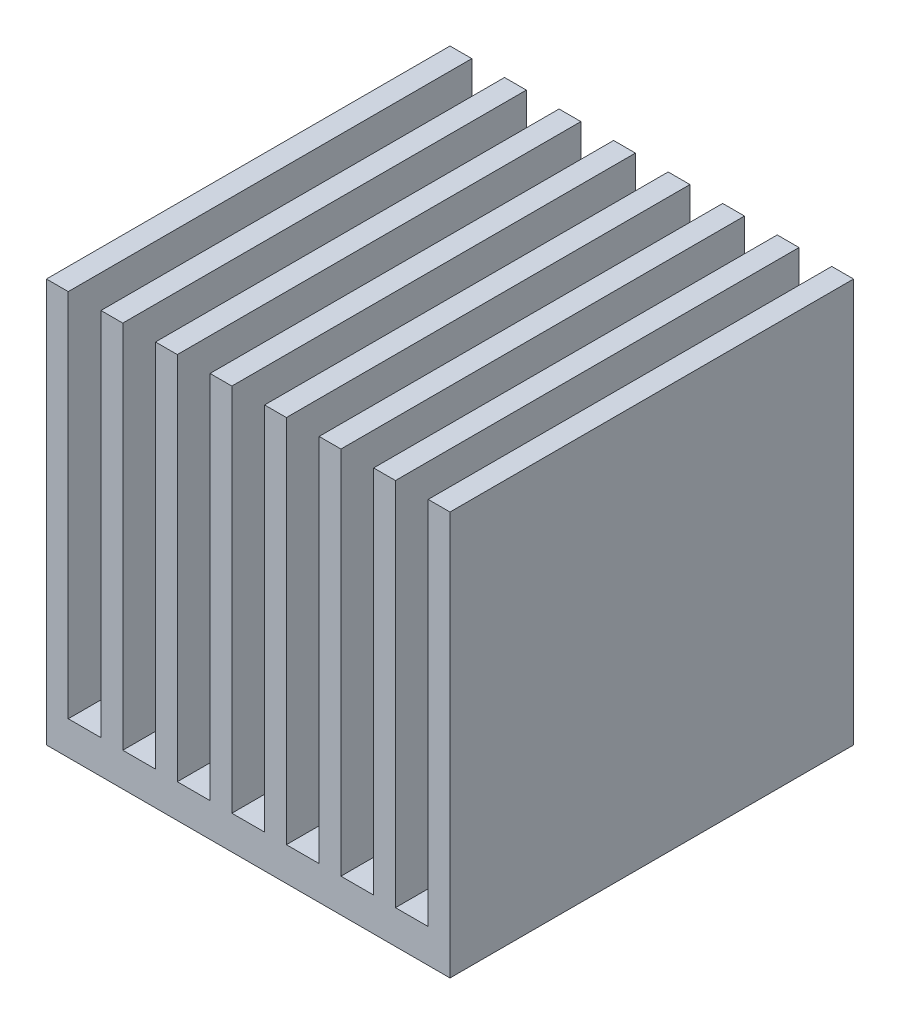
ISO-10303-21;
HEADER;
FILE_DESCRIPTION(('STEP AP214'),'2;1');
FILE_NAME('part.step','',(''),(''),'','','');
FILE_SCHEMA(('AUTOMOTIVE_DESIGN { 1 0 10303 214 1 1 1 1 }'));
ENDSEC;
DATA;
#1=APPLICATION_CONTEXT('core data for automotive mechanical design processes');
#2=APPLICATION_PROTOCOL_DEFINITION('international standard','automotive_design',2000,#1);
#3=PRODUCT_CONTEXT('',#1,'mechanical');
#4=PRODUCT('Part','Part','',(#3));
#5=PRODUCT_RELATED_PRODUCT_CATEGORY('part','',(#4));
#6=PRODUCT_DEFINITION_FORMATION('','',#4);
#7=PRODUCT_DEFINITION_CONTEXT('part definition',#1,'design');
#8=PRODUCT_DEFINITION('design','',#6,#7);
#9=PRODUCT_DEFINITION_SHAPE('','',#8);
#10=(LENGTH_UNIT() NAMED_UNIT(*) SI_UNIT(.MILLI.,.METRE.));
#11=(NAMED_UNIT(*) PLANE_ANGLE_UNIT() SI_UNIT($,.RADIAN.));
#12=(NAMED_UNIT(*) SI_UNIT($,.STERADIAN.) SOLID_ANGLE_UNIT());
#13=UNCERTAINTY_MEASURE_WITH_UNIT(LENGTH_MEASURE(1.E-05),#10,'distance_accuracy_value','');
#14=(GEOMETRIC_REPRESENTATION_CONTEXT(3) GLOBAL_UNCERTAINTY_ASSIGNED_CONTEXT((#13)) GLOBAL_UNIT_ASSIGNED_CONTEXT((#10,
#11,#12)) REPRESENTATION_CONTEXT('',''));
#15=CARTESIAN_POINT('',(0.,0.,0.));
#16=DIRECTION('',(0.,0.,1.));
#17=DIRECTION('',(1.,0.,0.));
#18=AXIS2_PLACEMENT_3D('',#15,#16,#17);
#19=CARTESIAN_POINT('',(0.,12.,0.));
#20=DIRECTION('',(0.,0.,1.));
#21=DIRECTION('',(1.,0.,0.));
#22=AXIS2_PLACEMENT_3D('',#19,#20,#21);
#23=PLANE('',#22);
#24=DIRECTION('',(0.,-1.,0.));
#25=VECTOR('',#24,1.);
#26=CARTESIAN_POINT('',(-8.75675675675675,0.,0.));
#27=LINE('',#26,#25);
#28=CARTESIAN_POINT('',(-8.75675675675675,12.,0.));
#29=VERTEX_POINT('',#28);
#30=CARTESIAN_POINT('',(-8.75675675675675,1.,0.));
#31=VERTEX_POINT('',#30);
#32=EDGE_CURVE('E248',#29,#31,#27,.T.);
#33=ORIENTED_EDGE('',*,*,#32,.F.);
#34=DIRECTION('',(-1.,0.,0.));
#35=VECTOR('',#34,1.);
#36=CARTESIAN_POINT('',(0.,12.,0.));
#37=LINE('',#36,#35);
#38=CARTESIAN_POINT('',(-8.10810810810811,12.,0.));
#39=VERTEX_POINT('',#38);
#40=EDGE_CURVE('E262',#39,#29,#37,.T.);
#41=ORIENTED_EDGE('',*,*,#40,.F.);
#42=DIRECTION('',(0.,1.,0.));
#43=VECTOR('',#42,1.);
#44=CARTESIAN_POINT('',(-8.10810810810811,0.,0.));
#45=LINE('',#44,#43);
#46=CARTESIAN_POINT('',(-8.10810810810811,1.,0.));
#47=VERTEX_POINT('',#46);
#48=EDGE_CURVE('E60',#47,#39,#45,.T.);
#49=ORIENTED_EDGE('',*,*,#48,.F.);
#50=DIRECTION('',(1.,0.,0.));
#51=VECTOR('',#50,1.);
#52=CARTESIAN_POINT('',(3.24324324324325,1.,0.));
#53=LINE('',#52,#51);
#54=CARTESIAN_POINT('',(-7.13513513513513,1.,0.));
#55=VERTEX_POINT('',#54);
#56=EDGE_CURVE('E635',#47,#55,#53,.T.);
#57=ORIENTED_EDGE('',*,*,#56,.T.);
#58=DIRECTION('',(0.,-1.,0.));
#59=VECTOR('',#58,1.);
#60=CARTESIAN_POINT('',(-7.13513513513513,0.,0.));
#61=LINE('',#60,#59);
#62=CARTESIAN_POINT('',(-7.13513513513513,12.,0.));
#63=VERTEX_POINT('',#62);
#64=EDGE_CURVE('E631',#63,#55,#61,.T.);
#65=ORIENTED_EDGE('',*,*,#64,.F.);
#66=CARTESIAN_POINT('',(-6.48648648648648,12.,0.));
#67=VERTEX_POINT('',#66);
#68=EDGE_CURVE('E268',#67,#63,#37,.T.);
#69=ORIENTED_EDGE('',*,*,#68,.F.);
#70=DIRECTION('',(0.,1.,0.));
#71=VECTOR('',#70,1.);
#72=CARTESIAN_POINT('',(-6.48648648648648,0.,0.));
#73=LINE('',#72,#71);
#74=CARTESIAN_POINT('',(-6.48648648648648,1.,0.));
#75=VERTEX_POINT('',#74);
#76=EDGE_CURVE('E359',#75,#67,#73,.T.);
#77=ORIENTED_EDGE('',*,*,#76,.F.);
#78=DIRECTION('',(1.,0.,0.));
#79=VECTOR('',#78,1.);
#80=CARTESIAN_POINT('',(4.86486486486487,1.,0.));
#81=LINE('',#80,#79);
#82=CARTESIAN_POINT('',(-5.51351351351351,1.,0.));
#83=VERTEX_POINT('',#82);
#84=EDGE_CURVE('E356',#75,#83,#81,.T.);
#85=ORIENTED_EDGE('',*,*,#84,.T.);
#86=DIRECTION('',(0.,-1.,0.));
#87=VECTOR('',#86,1.);
#88=CARTESIAN_POINT('',(-5.51351351351351,0.,0.));
#89=LINE('',#88,#87);
#90=CARTESIAN_POINT('',(-5.51351351351351,12.,0.));
#91=VERTEX_POINT('',#90);
#92=EDGE_CURVE('E353',#91,#83,#89,.T.);
#93=ORIENTED_EDGE('',*,*,#92,.F.);
#94=CARTESIAN_POINT('',(-4.86486486486486,12.,0.));
#95=VERTEX_POINT('',#94);
#96=EDGE_CURVE('E272',#95,#91,#37,.T.);
#97=ORIENTED_EDGE('',*,*,#96,.F.);
#98=DIRECTION('',(0.,1.,0.));
#99=VECTOR('',#98,1.);
#100=CARTESIAN_POINT('',(-4.86486486486486,0.,0.));
#101=LINE('',#100,#99);
#102=CARTESIAN_POINT('',(-4.86486486486486,1.,0.));
#103=VERTEX_POINT('',#102);
#104=EDGE_CURVE('E351',#103,#95,#101,.T.);
#105=ORIENTED_EDGE('',*,*,#104,.F.);
#106=DIRECTION('',(1.,0.,0.));
#107=VECTOR('',#106,1.);
#108=CARTESIAN_POINT('',(6.48648648648649,1.,0.));
#109=LINE('',#108,#107);
#110=CARTESIAN_POINT('',(-3.89189189189188,1.,0.));
#111=VERTEX_POINT('',#110);
#112=EDGE_CURVE('E389',#103,#111,#109,.T.);
#113=ORIENTED_EDGE('',*,*,#112,.T.);
#114=DIRECTION('',(0.,-1.,0.));
#115=VECTOR('',#114,1.);
#116=CARTESIAN_POINT('',(-3.89189189189188,0.,0.));
#117=LINE('',#116,#115);
#118=CARTESIAN_POINT('',(-3.89189189189188,12.,0.));
#119=VERTEX_POINT('',#118);
#120=EDGE_CURVE('E385',#119,#111,#117,.T.);
#121=ORIENTED_EDGE('',*,*,#120,.F.);
#122=CARTESIAN_POINT('',(-3.24324324324324,12.,0.));
#123=VERTEX_POINT('',#122);
#124=EDGE_CURVE('E328',#123,#119,#37,.T.);
#125=ORIENTED_EDGE('',*,*,#124,.F.);
#126=DIRECTION('',(0.,1.,0.));
#127=VECTOR('',#126,1.);
#128=CARTESIAN_POINT('',(-3.24324324324324,0.,0.));
#129=LINE('',#128,#127);
#130=CARTESIAN_POINT('',(-3.24324324324324,1.,0.));
#131=VERTEX_POINT('',#130);
#132=EDGE_CURVE('E408',#131,#123,#129,.T.);
#133=ORIENTED_EDGE('',*,*,#132,.F.);
#134=DIRECTION('',(1.,0.,0.));
#135=VECTOR('',#134,1.);
#136=CARTESIAN_POINT('',(8.10810810810811,1.,0.));
#137=LINE('',#136,#135);
#138=CARTESIAN_POINT('',(-2.27027027027026,1.,0.));
#139=VERTEX_POINT('',#138);
#140=EDGE_CURVE('E411',#131,#139,#137,.T.);
#141=ORIENTED_EDGE('',*,*,#140,.T.);
#142=DIRECTION('',(0.,-1.,0.));
#143=VECTOR('',#142,1.);
#144=CARTESIAN_POINT('',(-2.27027027027026,0.,0.));
#145=LINE('',#144,#143);
#146=CARTESIAN_POINT('',(-2.27027027027026,12.,0.));
#147=VERTEX_POINT('',#146);
#148=EDGE_CURVE('E406',#147,#139,#145,.T.);
#149=ORIENTED_EDGE('',*,*,#148,.F.);
#150=CARTESIAN_POINT('',(-1.62162162162161,12.,0.));
#151=VERTEX_POINT('',#150);
#152=EDGE_CURVE('E279',#151,#147,#37,.T.);
#153=ORIENTED_EDGE('',*,*,#152,.F.);
#154=DIRECTION('',(0.,1.,0.));
#155=VECTOR('',#154,1.);
#156=CARTESIAN_POINT('',(-1.62162162162161,0.,0.));
#157=LINE('',#156,#155);
#158=CARTESIAN_POINT('',(-1.62162162162161,1.,0.));
#159=VERTEX_POINT('',#158);
#160=EDGE_CURVE('E432',#159,#151,#157,.T.);
#161=ORIENTED_EDGE('',*,*,#160,.F.);
#162=DIRECTION('',(1.,0.,0.));
#163=VECTOR('',#162,1.);
#164=CARTESIAN_POINT('',(9.72972972972974,1.,0.));
#165=LINE('',#164,#163);
#166=CARTESIAN_POINT('',(-0.648648648648638,1.,0.));
#167=VERTEX_POINT('',#166);
#168=EDGE_CURVE('E435',#159,#167,#165,.T.);
#169=ORIENTED_EDGE('',*,*,#168,.T.);
#170=DIRECTION('',(0.,-1.,0.));
#171=VECTOR('',#170,1.);
#172=CARTESIAN_POINT('',(-0.648648648648638,0.,0.));
#173=LINE('',#172,#171);
#174=CARTESIAN_POINT('',(-0.648648648648638,12.,0.));
#175=VERTEX_POINT('',#174);
#176=EDGE_CURVE('E430',#175,#167,#173,.T.);
#177=ORIENTED_EDGE('',*,*,#176,.F.);
#178=CARTESIAN_POINT('',(0.,12.,0.));
#179=VERTEX_POINT('',#178);
#180=EDGE_CURVE('E274',#179,#175,#37,.T.);
#181=ORIENTED_EDGE('',*,*,#180,.F.);
#182=DIRECTION('',(0.,-1.,0.));
#183=VECTOR('',#182,1.);
#184=CARTESIAN_POINT('',(0.,12.,0.));
#185=LINE('',#184,#183);
#186=CARTESIAN_POINT('',(0.,0.,0.));
#187=VERTEX_POINT('',#186);
#188=EDGE_CURVE('E11',#179,#187,#185,.T.);
#189=ORIENTED_EDGE('',*,*,#188,.T.);
#190=DIRECTION('',(-1.,0.,0.));
#191=VECTOR('',#190,1.);
#192=CARTESIAN_POINT('',(0.,0.,0.));
#193=LINE('',#192,#191);
#194=CARTESIAN_POINT('',(-12.,0.,0.));
#195=VERTEX_POINT('',#194);
#196=EDGE_CURVE('E292',#187,#195,#193,.T.);
#197=ORIENTED_EDGE('',*,*,#196,.T.);
#198=DIRECTION('',(0.,-1.,0.));
#199=VECTOR('',#198,1.);
#200=CARTESIAN_POINT('',(-12.,12.,0.));
#201=LINE('',#200,#199);
#202=CARTESIAN_POINT('',(-12.,12.,0.));
#203=VERTEX_POINT('',#202);
#204=EDGE_CURVE('E45',#203,#195,#201,.T.);
#205=ORIENTED_EDGE('',*,*,#204,.F.);
#206=CARTESIAN_POINT('',(-11.3513513513513,12.,0.));
#207=VERTEX_POINT('',#206);
#208=EDGE_CURVE('E273',#207,#203,#37,.T.);
#209=ORIENTED_EDGE('',*,*,#208,.F.);
#210=DIRECTION('',(0.,1.,0.));
#211=VECTOR('',#210,1.);
#212=CARTESIAN_POINT('',(-11.3513513513513,0.,0.));
#213=LINE('',#212,#211);
#214=CARTESIAN_POINT('',(-11.3513513513513,1.,0.));
#215=VERTEX_POINT('',#214);
#216=EDGE_CURVE('E456',#215,#207,#213,.T.);
#217=ORIENTED_EDGE('',*,*,#216,.F.);
#218=DIRECTION('',(1.,0.,0.));
#219=VECTOR('',#218,1.);
#220=CARTESIAN_POINT('',(0.,1.,0.));
#221=LINE('',#220,#219);
#222=CARTESIAN_POINT('',(-10.3783783783784,1.,0.));
#223=VERTEX_POINT('',#222);
#224=EDGE_CURVE('E459',#215,#223,#221,.T.);
#225=ORIENTED_EDGE('',*,*,#224,.T.);
#226=DIRECTION('',(0.,-1.,0.));
#227=VECTOR('',#226,1.);
#228=CARTESIAN_POINT('',(-10.3783783783784,0.,0.));
#229=LINE('',#228,#227);
#230=CARTESIAN_POINT('',(-10.3783783783784,12.,0.));
#231=VERTEX_POINT('',#230);
#232=EDGE_CURVE('E454',#231,#223,#229,.T.);
#233=ORIENTED_EDGE('',*,*,#232,.F.);
#234=CARTESIAN_POINT('',(-9.72972972972973,12.,0.));
#235=VERTEX_POINT('',#234);
#236=EDGE_CURVE('E269',#235,#231,#37,.T.);
#237=ORIENTED_EDGE('',*,*,#236,.F.);
#238=DIRECTION('',(0.,1.,0.));
#239=VECTOR('',#238,1.);
#240=CARTESIAN_POINT('',(-9.72972972972973,0.,0.));
#241=LINE('',#240,#239);
#242=CARTESIAN_POINT('',(-9.72972972972973,1.,0.));
#243=VERTEX_POINT('',#242);
#244=EDGE_CURVE('E52',#243,#235,#241,.T.);
#245=ORIENTED_EDGE('',*,*,#244,.F.);
#246=DIRECTION('',(1.,0.,0.));
#247=VECTOR('',#246,1.);
#248=CARTESIAN_POINT('',(1.62162162162162,1.,0.));
#249=LINE('',#248,#247);
#250=EDGE_CURVE('E257',#243,#31,#249,.T.);
#251=ORIENTED_EDGE('',*,*,#250,.T.);
#252=EDGE_LOOP('',(#33,#41,#49,#57,#65,#69,#77,#85,#93,#97,#105,#113,#121,#125,#133,#141,#149,
#153,#161,#169,#177,#181,#189,#197,#205,#209,#217,#225,#233,#237,#245,#251));
#253=FACE_BOUND('',#252,.T.);
#254=ADVANCED_FACE('F37',(#253),#23,.F.);
#255=CARTESIAN_POINT('',(0.,12.,12.));
#256=DIRECTION('',(0.,0.,-1.));
#257=DIRECTION('',(-1.,0.,0.));
#258=AXIS2_PLACEMENT_3D('',#255,#256,#257);
#259=PLANE('',#258);
#260=DIRECTION('',(0.,-1.,0.));
#261=VECTOR('',#260,1.);
#262=CARTESIAN_POINT('',(-8.75675675675675,0.,12.));
#263=LINE('',#262,#261);
#264=CARTESIAN_POINT('',(-8.75675675675675,12.,12.));
#265=VERTEX_POINT('',#264);
#266=CARTESIAN_POINT('',(-8.75675675675675,1.,12.));
#267=VERTEX_POINT('',#266);
#268=EDGE_CURVE('E251',#265,#267,#263,.T.);
#269=ORIENTED_EDGE('',*,*,#268,.T.);
#270=DIRECTION('',(1.,0.,0.));
#271=VECTOR('',#270,1.);
#272=CARTESIAN_POINT('',(1.62162162162162,1.,12.));
#273=LINE('',#272,#271);
#274=CARTESIAN_POINT('',(-9.72972972972973,1.,12.));
#275=VERTEX_POINT('',#274);
#276=EDGE_CURVE('E264',#275,#267,#273,.T.);
#277=ORIENTED_EDGE('',*,*,#276,.F.);
#278=DIRECTION('',(0.,1.,0.));
#279=VECTOR('',#278,1.);
#280=CARTESIAN_POINT('',(-9.72972972972973,0.,12.));
#281=LINE('',#280,#279);
#282=CARTESIAN_POINT('',(-9.72972972972973,12.,12.));
#283=VERTEX_POINT('',#282);
#284=EDGE_CURVE('E489',#275,#283,#281,.T.);
#285=ORIENTED_EDGE('',*,*,#284,.T.);
#286=DIRECTION('',(1.,0.,0.));
#287=VECTOR('',#286,1.);
#288=CARTESIAN_POINT('',(0.,12.,12.));
#289=LINE('',#288,#287);
#290=CARTESIAN_POINT('',(-10.3783783783784,12.,12.));
#291=VERTEX_POINT('',#290);
#292=EDGE_CURVE('E288',#291,#283,#289,.T.);
#293=ORIENTED_EDGE('',*,*,#292,.F.);
#294=DIRECTION('',(0.,-1.,0.));
#295=VECTOR('',#294,1.);
#296=CARTESIAN_POINT('',(-10.3783783783784,0.,12.));
#297=LINE('',#296,#295);
#298=CARTESIAN_POINT('',(-10.3783783783784,1.,12.));
#299=VERTEX_POINT('',#298);
#300=EDGE_CURVE('E463',#291,#299,#297,.T.);
#301=ORIENTED_EDGE('',*,*,#300,.T.);
#302=DIRECTION('',(1.,0.,0.));
#303=VECTOR('',#302,1.);
#304=CARTESIAN_POINT('',(0.,1.,12.));
#305=LINE('',#304,#303);
#306=CARTESIAN_POINT('',(-11.3513513513513,1.,12.));
#307=VERTEX_POINT('',#306);
#308=EDGE_CURVE('E457',#307,#299,#305,.T.);
#309=ORIENTED_EDGE('',*,*,#308,.F.);
#310=DIRECTION('',(0.,1.,0.));
#311=VECTOR('',#310,1.);
#312=CARTESIAN_POINT('',(-11.3513513513513,0.,12.));
#313=LINE('',#312,#311);
#314=CARTESIAN_POINT('',(-11.3513513513513,12.,12.));
#315=VERTEX_POINT('',#314);
#316=EDGE_CURVE('E466',#307,#315,#313,.T.);
#317=ORIENTED_EDGE('',*,*,#316,.T.);
#318=CARTESIAN_POINT('',(-12.,12.,12.));
#319=VERTEX_POINT('',#318);
#320=EDGE_CURVE('E284',#319,#315,#289,.T.);
#321=ORIENTED_EDGE('',*,*,#320,.F.);
#322=DIRECTION('',(0.,-1.,0.));
#323=VECTOR('',#322,1.);
#324=CARTESIAN_POINT('',(-12.,12.,12.));
#325=LINE('',#324,#323);
#326=CARTESIAN_POINT('',(-12.,0.,12.));
#327=VERTEX_POINT('',#326);
#328=EDGE_CURVE('E301',#319,#327,#325,.T.);
#329=ORIENTED_EDGE('',*,*,#328,.T.);
#330=DIRECTION('',(1.,0.,0.));
#331=VECTOR('',#330,1.);
#332=CARTESIAN_POINT('',(0.,0.,12.));
#333=LINE('',#332,#331);
#334=CARTESIAN_POINT('',(0.,0.,12.));
#335=VERTEX_POINT('',#334);
#336=EDGE_CURVE('E297',#327,#335,#333,.T.);
#337=ORIENTED_EDGE('',*,*,#336,.T.);
#338=DIRECTION('',(0.,-1.,0.));
#339=VECTOR('',#338,1.);
#340=CARTESIAN_POINT('',(0.,12.,12.));
#341=LINE('',#340,#339);
#342=CARTESIAN_POINT('',(0.,12.,12.));
#343=VERTEX_POINT('',#342);
#344=EDGE_CURVE('E287',#343,#335,#341,.T.);
#345=ORIENTED_EDGE('',*,*,#344,.F.);
#346=CARTESIAN_POINT('',(-0.648648648648638,12.,12.));
#347=VERTEX_POINT('',#346);
#348=EDGE_CURVE('E283',#347,#343,#289,.T.);
#349=ORIENTED_EDGE('',*,*,#348,.F.);
#350=DIRECTION('',(0.,-1.,0.));
#351=VECTOR('',#350,1.);
#352=CARTESIAN_POINT('',(-0.648648648648638,0.,12.));
#353=LINE('',#352,#351);
#354=CARTESIAN_POINT('',(-0.648648648648638,1.,12.));
#355=VERTEX_POINT('',#354);
#356=EDGE_CURVE('E439',#347,#355,#353,.T.);
#357=ORIENTED_EDGE('',*,*,#356,.T.);
#358=DIRECTION('',(1.,0.,0.));
#359=VECTOR('',#358,1.);
#360=CARTESIAN_POINT('',(9.72972972972974,1.,12.));
#361=LINE('',#360,#359);
#362=CARTESIAN_POINT('',(-1.62162162162161,1.,12.));
#363=VERTEX_POINT('',#362);
#364=EDGE_CURVE('E433',#363,#355,#361,.T.);
#365=ORIENTED_EDGE('',*,*,#364,.F.);
#366=DIRECTION('',(0.,1.,0.));
#367=VECTOR('',#366,1.);
#368=CARTESIAN_POINT('',(-1.62162162162161,0.,12.));
#369=LINE('',#368,#367);
#370=CARTESIAN_POINT('',(-1.62162162162161,12.,12.));
#371=VERTEX_POINT('',#370);
#372=EDGE_CURVE('E442',#363,#371,#369,.T.);
#373=ORIENTED_EDGE('',*,*,#372,.T.);
#374=CARTESIAN_POINT('',(-2.27027027027026,12.,12.));
#375=VERTEX_POINT('',#374);
#376=EDGE_CURVE('E500',#375,#371,#289,.T.);
#377=ORIENTED_EDGE('',*,*,#376,.F.);
#378=DIRECTION('',(0.,-1.,0.));
#379=VECTOR('',#378,1.);
#380=CARTESIAN_POINT('',(-2.27027027027026,0.,12.));
#381=LINE('',#380,#379);
#382=CARTESIAN_POINT('',(-2.27027027027026,1.,12.));
#383=VERTEX_POINT('',#382);
#384=EDGE_CURVE('E415',#375,#383,#381,.T.);
#385=ORIENTED_EDGE('',*,*,#384,.T.);
#386=DIRECTION('',(1.,0.,0.));
#387=VECTOR('',#386,1.);
#388=CARTESIAN_POINT('',(8.10810810810811,1.,12.));
#389=LINE('',#388,#387);
#390=CARTESIAN_POINT('',(-3.24324324324324,1.,12.));
#391=VERTEX_POINT('',#390);
#392=EDGE_CURVE('E409',#391,#383,#389,.T.);
#393=ORIENTED_EDGE('',*,*,#392,.F.);
#394=DIRECTION('',(0.,1.,0.));
#395=VECTOR('',#394,1.);
#396=CARTESIAN_POINT('',(-3.24324324324324,0.,12.));
#397=LINE('',#396,#395);
#398=CARTESIAN_POINT('',(-3.24324324324324,12.,12.));
#399=VERTEX_POINT('',#398);
#400=EDGE_CURVE('E418',#391,#399,#397,.T.);
#401=ORIENTED_EDGE('',*,*,#400,.T.);
#402=CARTESIAN_POINT('',(-3.89189189189188,12.,12.));
#403=VERTEX_POINT('',#402);
#404=EDGE_CURVE('E498',#403,#399,#289,.T.);
#405=ORIENTED_EDGE('',*,*,#404,.F.);
#406=DIRECTION('',(0.,-1.,0.));
#407=VECTOR('',#406,1.);
#408=CARTESIAN_POINT('',(-3.89189189189188,0.,12.));
#409=LINE('',#408,#407);
#410=CARTESIAN_POINT('',(-3.89189189189188,1.,12.));
#411=VERTEX_POINT('',#410);
#412=EDGE_CURVE('E392',#403,#411,#409,.T.);
#413=ORIENTED_EDGE('',*,*,#412,.T.);
#414=DIRECTION('',(1.,0.,0.));
#415=VECTOR('',#414,1.);
#416=CARTESIAN_POINT('',(6.48648648648649,1.,12.));
#417=LINE('',#416,#415);
#418=CARTESIAN_POINT('',(-4.86486486486486,1.,12.));
#419=VERTEX_POINT('',#418);
#420=EDGE_CURVE('E387',#419,#411,#417,.T.);
#421=ORIENTED_EDGE('',*,*,#420,.F.);
#422=DIRECTION('',(0.,1.,0.));
#423=VECTOR('',#422,1.);
#424=CARTESIAN_POINT('',(-4.86486486486486,0.,12.));
#425=LINE('',#424,#423);
#426=CARTESIAN_POINT('',(-4.86486486486486,12.,12.));
#427=VERTEX_POINT('',#426);
#428=EDGE_CURVE('E395',#419,#427,#425,.T.);
#429=ORIENTED_EDGE('',*,*,#428,.T.);
#430=CARTESIAN_POINT('',(-5.51351351351351,12.,12.));
#431=VERTEX_POINT('',#430);
#432=EDGE_CURVE('E493',#431,#427,#289,.T.);
#433=ORIENTED_EDGE('',*,*,#432,.F.);
#434=DIRECTION('',(0.,-1.,0.));
#435=VECTOR('',#434,1.);
#436=CARTESIAN_POINT('',(-5.51351351351351,0.,12.));
#437=LINE('',#436,#435);
#438=CARTESIAN_POINT('',(-5.51351351351351,1.,12.));
#439=VERTEX_POINT('',#438);
#440=EDGE_CURVE('E371',#431,#439,#437,.T.);
#441=ORIENTED_EDGE('',*,*,#440,.T.);
#442=DIRECTION('',(1.,0.,0.));
#443=VECTOR('',#442,1.);
#444=CARTESIAN_POINT('',(4.86486486486487,1.,12.));
#445=LINE('',#444,#443);
#446=CARTESIAN_POINT('',(-6.48648648648648,1.,12.));
#447=VERTEX_POINT('',#446);
#448=EDGE_CURVE('E360',#447,#439,#445,.T.);
#449=ORIENTED_EDGE('',*,*,#448,.F.);
#450=DIRECTION('',(0.,1.,0.));
#451=VECTOR('',#450,1.);
#452=CARTESIAN_POINT('',(-6.48648648648648,0.,12.));
#453=LINE('',#452,#451);
#454=CARTESIAN_POINT('',(-6.48648648648648,12.,12.));
#455=VERTEX_POINT('',#454);
#456=EDGE_CURVE('E364',#447,#455,#453,.T.);
#457=ORIENTED_EDGE('',*,*,#456,.T.);
#458=CARTESIAN_POINT('',(-7.13513513513513,12.,12.));
#459=VERTEX_POINT('',#458);
#460=EDGE_CURVE('E491',#459,#455,#289,.T.);
#461=ORIENTED_EDGE('',*,*,#460,.F.);
#462=DIRECTION('',(0.,-1.,0.));
#463=VECTOR('',#462,1.);
#464=CARTESIAN_POINT('',(-7.13513513513513,0.,12.));
#465=LINE('',#464,#463);
#466=CARTESIAN_POINT('',(-7.13513513513513,1.,12.));
#467=VERTEX_POINT('',#466);
#468=EDGE_CURVE('E379',#459,#467,#465,.T.);
#469=ORIENTED_EDGE('',*,*,#468,.T.);
#470=DIRECTION('',(1.,0.,0.));
#471=VECTOR('',#470,1.);
#472=CARTESIAN_POINT('',(3.24324324324325,1.,12.));
#473=LINE('',#472,#471);
#474=CARTESIAN_POINT('',(-8.10810810810811,1.,12.));
#475=VERTEX_POINT('',#474);
#476=EDGE_CURVE('E633',#475,#467,#473,.T.);
#477=ORIENTED_EDGE('',*,*,#476,.F.);
#478=DIRECTION('',(0.,1.,0.));
#479=VECTOR('',#478,1.);
#480=CARTESIAN_POINT('',(-8.10810810810811,0.,12.));
#481=LINE('',#480,#479);
#482=CARTESIAN_POINT('',(-8.10810810810811,12.,12.));
#483=VERTEX_POINT('',#482);
#484=EDGE_CURVE('E640',#475,#483,#481,.T.);
#485=ORIENTED_EDGE('',*,*,#484,.T.);
#486=EDGE_CURVE('E490',#265,#483,#289,.T.);
#487=ORIENTED_EDGE('',*,*,#486,.F.);
#488=EDGE_LOOP('',(#269,#277,#285,#293,#301,#309,#317,#321,#329,#337,#345,#349,#357,#365,#373,
#377,#385,#393,#401,#405,#413,#421,#429,#433,#441,#449,#457,#461,#469,#477,#485,#487));
#489=FACE_BOUND('',#488,.T.);
#490=ADVANCED_FACE('F317',(#489),#259,.F.);
#491=CARTESIAN_POINT('',(0.,12.,0.));
#492=DIRECTION('',(0.,-1.,0.));
#493=DIRECTION('',(0.,0.,-1.));
#494=AXIS2_PLACEMENT_3D('',#491,#492,#493);
#495=PLANE('',#494);
#496=DIRECTION('',(0.,0.,1.));
#497=VECTOR('',#496,1.);
#498=CARTESIAN_POINT('',(-8.75675675675675,12.,0.));
#499=LINE('',#498,#497);
#500=EDGE_CURVE('E245',#29,#265,#499,.T.);
#501=ORIENTED_EDGE('',*,*,#500,.T.);
#502=ORIENTED_EDGE('',*,*,#486,.T.);
#503=DIRECTION('',(0.,0.,1.));
#504=VECTOR('',#503,1.);
#505=CARTESIAN_POINT('',(-8.10810810810811,12.,0.));
#506=LINE('',#505,#504);
#507=EDGE_CURVE('E267',#39,#483,#506,.T.);
#508=ORIENTED_EDGE('',*,*,#507,.F.);
#509=ORIENTED_EDGE('',*,*,#40,.T.);
#510=EDGE_LOOP('',(#501,#502,#508,#509));
#511=FACE_BOUND('',#510,.T.);
#512=ADVANCED_FACE('F266',(#511),#495,.F.);
#513=DIRECTION('',(0.,0.,1.));
#514=VECTOR('',#513,1.);
#515=CARTESIAN_POINT('',(-9.72972972972973,12.,0.));
#516=LINE('',#515,#514);
#517=EDGE_CURVE('E256',#235,#283,#516,.T.);
#518=ORIENTED_EDGE('',*,*,#517,.F.);
#519=ORIENTED_EDGE('',*,*,#236,.T.);
#520=DIRECTION('',(0.,0.,1.));
#521=VECTOR('',#520,1.);
#522=CARTESIAN_POINT('',(-10.3783783783784,12.,0.));
#523=LINE('',#522,#521);
#524=EDGE_CURVE('E462',#231,#291,#523,.T.);
#525=ORIENTED_EDGE('',*,*,#524,.T.);
#526=ORIENTED_EDGE('',*,*,#292,.T.);
#527=EDGE_LOOP('',(#518,#519,#525,#526));
#528=FACE_BOUND('',#527,.T.);
#529=ADVANCED_FACE('F481',(#528),#495,.F.);
#530=DIRECTION('',(0.,0.,1.));
#531=VECTOR('',#530,1.);
#532=CARTESIAN_POINT('',(-7.13513513513513,12.,0.));
#533=LINE('',#532,#531);
#534=EDGE_CURVE('E367',#63,#459,#533,.T.);
#535=ORIENTED_EDGE('',*,*,#534,.T.);
#536=ORIENTED_EDGE('',*,*,#460,.T.);
#537=DIRECTION('',(0.,0.,1.));
#538=VECTOR('',#537,1.);
#539=CARTESIAN_POINT('',(-6.48648648648648,12.,0.));
#540=LINE('',#539,#538);
#541=EDGE_CURVE('E382',#67,#455,#540,.T.);
#542=ORIENTED_EDGE('',*,*,#541,.F.);
#543=ORIENTED_EDGE('',*,*,#68,.T.);
#544=EDGE_LOOP('',(#535,#536,#542,#543));
#545=FACE_BOUND('',#544,.T.);
#546=ADVANCED_FACE('F645',(#545),#495,.F.);
#547=DIRECTION('',(0.,0.,1.));
#548=VECTOR('',#547,1.);
#549=CARTESIAN_POINT('',(-5.51351351351351,12.,0.));
#550=LINE('',#549,#548);
#551=EDGE_CURVE('E345',#91,#431,#550,.T.);
#552=ORIENTED_EDGE('',*,*,#551,.T.);
#553=ORIENTED_EDGE('',*,*,#432,.T.);
#554=DIRECTION('',(0.,0.,1.));
#555=VECTOR('',#554,1.);
#556=CARTESIAN_POINT('',(-4.86486486486486,12.,0.));
#557=LINE('',#556,#555);
#558=EDGE_CURVE('E347',#95,#427,#557,.T.);
#559=ORIENTED_EDGE('',*,*,#558,.F.);
#560=ORIENTED_EDGE('',*,*,#96,.T.);
#561=EDGE_LOOP('',(#552,#553,#559,#560));
#562=FACE_BOUND('',#561,.T.);
#563=ADVANCED_FACE('F343',(#562),#495,.F.);
#564=DIRECTION('',(0.,0.,1.));
#565=VECTOR('',#564,1.);
#566=CARTESIAN_POINT('',(-3.89189189189188,12.,0.));
#567=LINE('',#566,#565);
#568=EDGE_CURVE('E391',#119,#403,#567,.T.);
#569=ORIENTED_EDGE('',*,*,#568,.T.);
#570=ORIENTED_EDGE('',*,*,#404,.T.);
#571=DIRECTION('',(0.,0.,1.));
#572=VECTOR('',#571,1.);
#573=CARTESIAN_POINT('',(-3.24324324324324,12.,0.));
#574=LINE('',#573,#572);
#575=EDGE_CURVE('E427',#123,#399,#574,.T.);
#576=ORIENTED_EDGE('',*,*,#575,.F.);
#577=ORIENTED_EDGE('',*,*,#124,.T.);
#578=EDGE_LOOP('',(#569,#570,#576,#577));
#579=FACE_BOUND('',#578,.T.);
#580=ADVANCED_FACE('F524',(#579),#495,.F.);
#581=DIRECTION('',(0.,0.,1.));
#582=VECTOR('',#581,1.);
#583=CARTESIAN_POINT('',(-2.27027027027026,12.,0.));
#584=LINE('',#583,#582);
#585=EDGE_CURVE('E414',#147,#375,#584,.T.);
#586=ORIENTED_EDGE('',*,*,#585,.T.);
#587=ORIENTED_EDGE('',*,*,#376,.T.);
#588=DIRECTION('',(0.,0.,1.));
#589=VECTOR('',#588,1.);
#590=CARTESIAN_POINT('',(-1.62162162162161,12.,0.));
#591=LINE('',#590,#589);
#592=EDGE_CURVE('E450',#151,#371,#591,.T.);
#593=ORIENTED_EDGE('',*,*,#592,.F.);
#594=ORIENTED_EDGE('',*,*,#152,.T.);
#595=EDGE_LOOP('',(#586,#587,#593,#594));
#596=FACE_BOUND('',#595,.T.);
#597=ADVANCED_FACE('F522',(#596),#495,.F.);
#598=DIRECTION('',(0.,0.,1.));
#599=VECTOR('',#598,1.);
#600=CARTESIAN_POINT('',(-0.648648648648638,12.,0.));
#601=LINE('',#600,#599);
#602=EDGE_CURVE('E438',#175,#347,#601,.T.);
#603=ORIENTED_EDGE('',*,*,#602,.T.);
#604=ORIENTED_EDGE('',*,*,#348,.T.);
#605=DIRECTION('',(0.,0.,-1.));
#606=VECTOR('',#605,1.);
#607=CARTESIAN_POINT('',(0.,12.,0.));
#608=LINE('',#607,#606);
#609=EDGE_CURVE('E280',#343,#179,#608,.T.);
#610=ORIENTED_EDGE('',*,*,#609,.T.);
#611=ORIENTED_EDGE('',*,*,#180,.T.);
#612=EDGE_LOOP('',(#603,#604,#610,#611));
#613=FACE_BOUND('',#612,.T.);
#614=ADVANCED_FACE('F504',(#613),#495,.F.);
#615=DIRECTION('',(0.,0.,1.));
#616=VECTOR('',#615,1.);
#617=CARTESIAN_POINT('',(-11.3513513513513,12.,0.));
#618=LINE('',#617,#616);
#619=EDGE_CURVE('E475',#207,#315,#618,.T.);
#620=ORIENTED_EDGE('',*,*,#619,.F.);
#621=ORIENTED_EDGE('',*,*,#208,.T.);
#622=DIRECTION('',(0.,0.,1.));
#623=VECTOR('',#622,1.);
#624=CARTESIAN_POINT('',(-12.,12.,0.));
#625=LINE('',#624,#623);
#626=EDGE_CURVE('E278',#203,#319,#625,.T.);
#627=ORIENTED_EDGE('',*,*,#626,.T.);
#628=ORIENTED_EDGE('',*,*,#320,.T.);
#629=EDGE_LOOP('',(#620,#621,#627,#628));
#630=FACE_BOUND('',#629,.T.);
#631=ADVANCED_FACE('F530',(#630),#495,.F.);
#632=CARTESIAN_POINT('',(0.,12.,0.));
#633=DIRECTION('',(-1.,0.,0.));
#634=DIRECTION('',(0.,0.,1.));
#635=AXIS2_PLACEMENT_3D('',#632,#633,#634);
#636=PLANE('',#635);
#637=DIRECTION('',(0.,0.,-1.));
#638=VECTOR('',#637,1.);
#639=CARTESIAN_POINT('',(0.,0.,0.));
#640=LINE('',#639,#638);
#641=EDGE_CURVE('E289',#335,#187,#640,.T.);
#642=ORIENTED_EDGE('',*,*,#641,.T.);
#643=ORIENTED_EDGE('',*,*,#188,.F.);
#644=ORIENTED_EDGE('',*,*,#609,.F.);
#645=ORIENTED_EDGE('',*,*,#344,.T.);
#646=EDGE_LOOP('',(#642,#643,#644,#645));
#647=FACE_BOUND('',#646,.T.);
#648=ADVANCED_FACE('F39',(#647),#636,.F.);
#649=CARTESIAN_POINT('',(-12.,12.,0.));
#650=DIRECTION('',(1.,0.,0.));
#651=DIRECTION('',(0.,0.,-1.));
#652=AXIS2_PLACEMENT_3D('',#649,#650,#651);
#653=PLANE('',#652);
#654=DIRECTION('',(0.,0.,1.));
#655=VECTOR('',#654,1.);
#656=CARTESIAN_POINT('',(-12.,0.,0.));
#657=LINE('',#656,#655);
#658=EDGE_CURVE('E295',#195,#327,#657,.T.);
#659=ORIENTED_EDGE('',*,*,#658,.T.);
#660=ORIENTED_EDGE('',*,*,#328,.F.);
#661=ORIENTED_EDGE('',*,*,#626,.F.);
#662=ORIENTED_EDGE('',*,*,#204,.T.);
#663=EDGE_LOOP('',(#659,#660,#661,#662));
#664=FACE_BOUND('',#663,.T.);
#665=ADVANCED_FACE('F308',(#664),#653,.F.);
#666=CARTESIAN_POINT('',(0.,0.,0.));
#667=DIRECTION('',(0.,-1.,0.));
#668=DIRECTION('',(0.,0.,-1.));
#669=AXIS2_PLACEMENT_3D('',#666,#667,#668);
#670=PLANE('',#669);
#671=ORIENTED_EDGE('',*,*,#641,.F.);
#672=ORIENTED_EDGE('',*,*,#336,.F.);
#673=ORIENTED_EDGE('',*,*,#658,.F.);
#674=ORIENTED_EDGE('',*,*,#196,.F.);
#675=EDGE_LOOP('',(#671,#672,#673,#674));
#676=FACE_BOUND('',#675,.T.);
#677=ADVANCED_FACE('F314',(#676),#670,.T.);
#678=CARTESIAN_POINT('',(-10.3783783783784,0.,0.));
#679=DIRECTION('',(-1.,0.,0.));
#680=DIRECTION('',(0.,-1.,0.));
#681=AXIS2_PLACEMENT_3D('',#678,#679,#680);
#682=PLANE('',#681);
#683=ORIENTED_EDGE('',*,*,#300,.F.);
#684=ORIENTED_EDGE('',*,*,#524,.F.);
#685=ORIENTED_EDGE('',*,*,#232,.T.);
#686=DIRECTION('',(0.,0.,1.));
#687=VECTOR('',#686,1.);
#688=CARTESIAN_POINT('',(-10.3783783783784,1.,0.));
#689=LINE('',#688,#687);
#690=EDGE_CURVE('E293',#223,#299,#689,.T.);
#691=ORIENTED_EDGE('',*,*,#690,.T.);
#692=EDGE_LOOP('',(#683,#684,#685,#691));
#693=FACE_BOUND('',#692,.T.);
#694=ADVANCED_FACE('F541',(#693),#682,.T.);
#695=CARTESIAN_POINT('',(0.,1.,0.));
#696=DIRECTION('',(0.,-1.,0.));
#697=DIRECTION('',(0.,0.,-1.));
#698=AXIS2_PLACEMENT_3D('',#695,#696,#697);
#699=PLANE('',#698);
#700=ORIENTED_EDGE('',*,*,#308,.T.);
#701=ORIENTED_EDGE('',*,*,#690,.F.);
#702=ORIENTED_EDGE('',*,*,#224,.F.);
#703=DIRECTION('',(0.,0.,1.));
#704=VECTOR('',#703,1.);
#705=CARTESIAN_POINT('',(-11.3513513513513,1.,0.));
#706=LINE('',#705,#704);
#707=EDGE_CURVE('E473',#215,#307,#706,.T.);
#708=ORIENTED_EDGE('',*,*,#707,.T.);
#709=EDGE_LOOP('',(#700,#701,#702,#708));
#710=FACE_BOUND('',#709,.T.);
#711=ADVANCED_FACE('F545',(#710),#699,.F.);
#712=CARTESIAN_POINT('',(-11.3513513513513,0.,0.));
#713=DIRECTION('',(1.,0.,0.));
#714=DIRECTION('',(0.,0.,-1.));
#715=AXIS2_PLACEMENT_3D('',#712,#713,#714);
#716=PLANE('',#715);
#717=ORIENTED_EDGE('',*,*,#316,.F.);
#718=ORIENTED_EDGE('',*,*,#707,.F.);
#719=ORIENTED_EDGE('',*,*,#216,.T.);
#720=ORIENTED_EDGE('',*,*,#619,.T.);
#721=EDGE_LOOP('',(#717,#718,#719,#720));
#722=FACE_BOUND('',#721,.T.);
#723=ADVANCED_FACE('F549',(#722),#716,.T.);
#724=CARTESIAN_POINT('',(-0.648648648648638,0.,0.));
#725=DIRECTION('',(-1.,0.,0.));
#726=DIRECTION('',(0.,-1.,0.));
#727=AXIS2_PLACEMENT_3D('',#724,#725,#726);
#728=PLANE('',#727);
#729=ORIENTED_EDGE('',*,*,#356,.F.);
#730=ORIENTED_EDGE('',*,*,#602,.F.);
#731=ORIENTED_EDGE('',*,*,#176,.T.);
#732=DIRECTION('',(0.,0.,1.));
#733=VECTOR('',#732,1.);
#734=CARTESIAN_POINT('',(-0.648648648648638,1.,0.));
#735=LINE('',#734,#733);
#736=EDGE_CURVE('E419',#167,#355,#735,.T.);
#737=ORIENTED_EDGE('',*,*,#736,.T.);
#738=EDGE_LOOP('',(#729,#730,#731,#737));
#739=FACE_BOUND('',#738,.T.);
#740=ADVANCED_FACE('F507',(#739),#728,.T.);
#741=CARTESIAN_POINT('',(9.72972972972974,1.,0.));
#742=DIRECTION('',(0.,-1.,0.));
#743=DIRECTION('',(0.,0.,-1.));
#744=AXIS2_PLACEMENT_3D('',#741,#742,#743);
#745=PLANE('',#744);
#746=ORIENTED_EDGE('',*,*,#364,.T.);
#747=ORIENTED_EDGE('',*,*,#736,.F.);
#748=ORIENTED_EDGE('',*,*,#168,.F.);
#749=DIRECTION('',(0.,0.,1.));
#750=VECTOR('',#749,1.);
#751=CARTESIAN_POINT('',(-1.62162162162161,1.,0.));
#752=LINE('',#751,#750);
#753=EDGE_CURVE('E448',#159,#363,#752,.T.);
#754=ORIENTED_EDGE('',*,*,#753,.T.);
#755=EDGE_LOOP('',(#746,#747,#748,#754));
#756=FACE_BOUND('',#755,.T.);
#757=ADVANCED_FACE('F512',(#756),#745,.F.);
#758=CARTESIAN_POINT('',(-1.62162162162161,0.,0.));
#759=DIRECTION('',(1.,0.,0.));
#760=DIRECTION('',(0.,0.,-1.));
#761=AXIS2_PLACEMENT_3D('',#758,#759,#760);
#762=PLANE('',#761);
#763=ORIENTED_EDGE('',*,*,#372,.F.);
#764=ORIENTED_EDGE('',*,*,#753,.F.);
#765=ORIENTED_EDGE('',*,*,#160,.T.);
#766=ORIENTED_EDGE('',*,*,#592,.T.);
#767=EDGE_LOOP('',(#763,#764,#765,#766));
#768=FACE_BOUND('',#767,.T.);
#769=ADVANCED_FACE('F516',(#768),#762,.T.);
#770=CARTESIAN_POINT('',(-2.27027027027026,0.,0.));
#771=DIRECTION('',(-1.,0.,0.));
#772=DIRECTION('',(0.,-1.,0.));
#773=AXIS2_PLACEMENT_3D('',#770,#771,#772);
#774=PLANE('',#773);
#775=ORIENTED_EDGE('',*,*,#384,.F.);
#776=ORIENTED_EDGE('',*,*,#585,.F.);
#777=ORIENTED_EDGE('',*,*,#148,.T.);
#778=DIRECTION('',(0.,0.,1.));
#779=VECTOR('',#778,1.);
#780=CARTESIAN_POINT('',(-2.27027027027026,1.,0.));
#781=LINE('',#780,#779);
#782=EDGE_CURVE('E396',#139,#383,#781,.T.);
#783=ORIENTED_EDGE('',*,*,#782,.T.);
#784=EDGE_LOOP('',(#775,#776,#777,#783));
#785=FACE_BOUND('',#784,.T.);
#786=ADVANCED_FACE('F519',(#785),#774,.T.);
#787=CARTESIAN_POINT('',(8.10810810810811,1.,0.));
#788=DIRECTION('',(0.,-1.,0.));
#789=DIRECTION('',(0.,0.,-1.));
#790=AXIS2_PLACEMENT_3D('',#787,#788,#789);
#791=PLANE('',#790);
#792=ORIENTED_EDGE('',*,*,#392,.T.);
#793=ORIENTED_EDGE('',*,*,#782,.F.);
#794=ORIENTED_EDGE('',*,*,#140,.F.);
#795=DIRECTION('',(0.,0.,1.));
#796=VECTOR('',#795,1.);
#797=CARTESIAN_POINT('',(-3.24324324324324,1.,0.));
#798=LINE('',#797,#796);
#799=EDGE_CURVE('E425',#131,#391,#798,.T.);
#800=ORIENTED_EDGE('',*,*,#799,.T.);
#801=EDGE_LOOP('',(#792,#793,#794,#800));
#802=FACE_BOUND('',#801,.T.);
#803=ADVANCED_FACE('F564',(#802),#791,.F.);
#804=CARTESIAN_POINT('',(-3.24324324324324,0.,0.));
#805=DIRECTION('',(1.,0.,0.));
#806=DIRECTION('',(0.,0.,-1.));
#807=AXIS2_PLACEMENT_3D('',#804,#805,#806);
#808=PLANE('',#807);
#809=ORIENTED_EDGE('',*,*,#400,.F.);
#810=ORIENTED_EDGE('',*,*,#799,.F.);
#811=ORIENTED_EDGE('',*,*,#132,.T.);
#812=ORIENTED_EDGE('',*,*,#575,.T.);
#813=EDGE_LOOP('',(#809,#810,#811,#812));
#814=FACE_BOUND('',#813,.T.);
#815=ADVANCED_FACE('F565',(#814),#808,.T.);
#816=CARTESIAN_POINT('',(-3.89189189189188,0.,0.));
#817=DIRECTION('',(-1.,0.,0.));
#818=DIRECTION('',(0.,-1.,0.));
#819=AXIS2_PLACEMENT_3D('',#816,#817,#818);
#820=PLANE('',#819);
#821=ORIENTED_EDGE('',*,*,#412,.F.);
#822=ORIENTED_EDGE('',*,*,#568,.F.);
#823=ORIENTED_EDGE('',*,*,#120,.T.);
#824=DIRECTION('',(0.,0.,1.));
#825=VECTOR('',#824,1.);
#826=CARTESIAN_POINT('',(-3.89189189189188,1.,0.));
#827=LINE('',#826,#825);
#828=EDGE_CURVE('E374',#111,#411,#827,.T.);
#829=ORIENTED_EDGE('',*,*,#828,.T.);
#830=EDGE_LOOP('',(#821,#822,#823,#829));
#831=FACE_BOUND('',#830,.T.);
#832=ADVANCED_FACE('F568',(#831),#820,.T.);
#833=CARTESIAN_POINT('',(6.48648648648649,1.,0.));
#834=DIRECTION('',(0.,-1.,0.));
#835=DIRECTION('',(0.,0.,-1.));
#836=AXIS2_PLACEMENT_3D('',#833,#834,#835);
#837=PLANE('',#836);
#838=ORIENTED_EDGE('',*,*,#420,.T.);
#839=ORIENTED_EDGE('',*,*,#828,.F.);
#840=ORIENTED_EDGE('',*,*,#112,.F.);
#841=DIRECTION('',(0.,0.,1.));
#842=VECTOR('',#841,1.);
#843=CARTESIAN_POINT('',(-4.86486486486486,1.,0.));
#844=LINE('',#843,#842);
#845=EDGE_CURVE('E402',#103,#419,#844,.T.);
#846=ORIENTED_EDGE('',*,*,#845,.T.);
#847=EDGE_LOOP('',(#838,#839,#840,#846));
#848=FACE_BOUND('',#847,.T.);
#849=ADVANCED_FACE('F575',(#848),#837,.F.);
#850=CARTESIAN_POINT('',(-4.86486486486486,0.,0.));
#851=DIRECTION('',(1.,0.,0.));
#852=DIRECTION('',(0.,0.,-1.));
#853=AXIS2_PLACEMENT_3D('',#850,#851,#852);
#854=PLANE('',#853);
#855=ORIENTED_EDGE('',*,*,#428,.F.);
#856=ORIENTED_EDGE('',*,*,#845,.F.);
#857=ORIENTED_EDGE('',*,*,#104,.T.);
#858=ORIENTED_EDGE('',*,*,#558,.T.);
#859=EDGE_LOOP('',(#855,#856,#857,#858));
#860=FACE_BOUND('',#859,.T.);
#861=ADVANCED_FACE('F577',(#860),#854,.T.);
#862=CARTESIAN_POINT('',(-5.51351351351351,0.,0.));
#863=DIRECTION('',(-1.,0.,0.));
#864=DIRECTION('',(0.,-1.,0.));
#865=AXIS2_PLACEMENT_3D('',#862,#863,#864);
#866=PLANE('',#865);
#867=ORIENTED_EDGE('',*,*,#440,.F.);
#868=ORIENTED_EDGE('',*,*,#551,.F.);
#869=ORIENTED_EDGE('',*,*,#92,.T.);
#870=DIRECTION('',(0.,0.,1.));
#871=VECTOR('',#870,1.);
#872=CARTESIAN_POINT('',(-5.51351351351351,1.,0.));
#873=LINE('',#872,#871);
#874=EDGE_CURVE('E377',#83,#439,#873,.T.);
#875=ORIENTED_EDGE('',*,*,#874,.T.);
#876=EDGE_LOOP('',(#867,#868,#869,#875));
#877=FACE_BOUND('',#876,.T.);
#878=ADVANCED_FACE('F580',(#877),#866,.T.);
#879=CARTESIAN_POINT('',(4.86486486486487,1.,0.));
#880=DIRECTION('',(0.,-1.,0.));
#881=DIRECTION('',(0.,0.,-1.));
#882=AXIS2_PLACEMENT_3D('',#879,#880,#881);
#883=PLANE('',#882);
#884=ORIENTED_EDGE('',*,*,#448,.T.);
#885=ORIENTED_EDGE('',*,*,#874,.F.);
#886=ORIENTED_EDGE('',*,*,#84,.F.);
#887=DIRECTION('',(0.,0.,1.));
#888=VECTOR('',#887,1.);
#889=CARTESIAN_POINT('',(-6.48648648648648,1.,0.));
#890=LINE('',#889,#888);
#891=EDGE_CURVE('E380',#75,#447,#890,.T.);
#892=ORIENTED_EDGE('',*,*,#891,.T.);
#893=EDGE_LOOP('',(#884,#885,#886,#892));
#894=FACE_BOUND('',#893,.T.);
#895=ADVANCED_FACE('F587',(#894),#883,.F.);
#896=CARTESIAN_POINT('',(-6.48648648648648,0.,0.));
#897=DIRECTION('',(1.,0.,0.));
#898=DIRECTION('',(0.,0.,-1.));
#899=AXIS2_PLACEMENT_3D('',#896,#897,#898);
#900=PLANE('',#899);
#901=ORIENTED_EDGE('',*,*,#456,.F.);
#902=ORIENTED_EDGE('',*,*,#891,.F.);
#903=ORIENTED_EDGE('',*,*,#76,.T.);
#904=ORIENTED_EDGE('',*,*,#541,.T.);
#905=EDGE_LOOP('',(#901,#902,#903,#904));
#906=FACE_BOUND('',#905,.T.);
#907=ADVANCED_FACE('F588',(#906),#900,.T.);
#908=CARTESIAN_POINT('',(-7.13513513513513,0.,0.));
#909=DIRECTION('',(-1.,0.,0.));
#910=DIRECTION('',(0.,-1.,0.));
#911=AXIS2_PLACEMENT_3D('',#908,#909,#910);
#912=PLANE('',#911);
#913=ORIENTED_EDGE('',*,*,#468,.F.);
#914=ORIENTED_EDGE('',*,*,#534,.F.);
#915=ORIENTED_EDGE('',*,*,#64,.T.);
#916=DIRECTION('',(0.,0.,1.));
#917=VECTOR('',#916,1.);
#918=CARTESIAN_POINT('',(-7.13513513513513,1.,0.));
#919=LINE('',#918,#917);
#920=EDGE_CURVE('E620',#55,#467,#919,.T.);
#921=ORIENTED_EDGE('',*,*,#920,.T.);
#922=EDGE_LOOP('',(#913,#914,#915,#921));
#923=FACE_BOUND('',#922,.T.);
#924=ADVANCED_FACE('F591',(#923),#912,.T.);
#925=CARTESIAN_POINT('',(3.24324324324325,1.,0.));
#926=DIRECTION('',(0.,-1.,0.));
#927=DIRECTION('',(0.,0.,-1.));
#928=AXIS2_PLACEMENT_3D('',#925,#926,#927);
#929=PLANE('',#928);
#930=ORIENTED_EDGE('',*,*,#476,.T.);
#931=ORIENTED_EDGE('',*,*,#920,.F.);
#932=ORIENTED_EDGE('',*,*,#56,.F.);
#933=DIRECTION('',(0.,0.,1.));
#934=VECTOR('',#933,1.);
#935=CARTESIAN_POINT('',(-8.10810810810811,1.,0.));
#936=LINE('',#935,#934);
#937=EDGE_CURVE('E623',#47,#475,#936,.T.);
#938=ORIENTED_EDGE('',*,*,#937,.T.);
#939=EDGE_LOOP('',(#930,#931,#932,#938));
#940=FACE_BOUND('',#939,.T.);
#941=ADVANCED_FACE('F598',(#940),#929,.F.);
#942=CARTESIAN_POINT('',(-8.10810810810811,0.,0.));
#943=DIRECTION('',(1.,0.,0.));
#944=DIRECTION('',(0.,0.,-1.));
#945=AXIS2_PLACEMENT_3D('',#942,#943,#944);
#946=PLANE('',#945);
#947=ORIENTED_EDGE('',*,*,#484,.F.);
#948=ORIENTED_EDGE('',*,*,#937,.F.);
#949=ORIENTED_EDGE('',*,*,#48,.T.);
#950=ORIENTED_EDGE('',*,*,#507,.T.);
#951=EDGE_LOOP('',(#947,#948,#949,#950));
#952=FACE_BOUND('',#951,.T.);
#953=ADVANCED_FACE('F600',(#952),#946,.T.);
#954=CARTESIAN_POINT('',(-8.75675675675675,0.,0.));
#955=DIRECTION('',(-1.,0.,0.));
#956=DIRECTION('',(0.,-1.,0.));
#957=AXIS2_PLACEMENT_3D('',#954,#955,#956);
#958=PLANE('',#957);
#959=ORIENTED_EDGE('',*,*,#268,.F.);
#960=ORIENTED_EDGE('',*,*,#500,.F.);
#961=ORIENTED_EDGE('',*,*,#32,.T.);
#962=DIRECTION('',(0.,0.,1.));
#963=VECTOR('',#962,1.);
#964=CARTESIAN_POINT('',(-8.75675675675675,1.,0.));
#965=LINE('',#964,#963);
#966=EDGE_CURVE('E467',#31,#267,#965,.T.);
#967=ORIENTED_EDGE('',*,*,#966,.T.);
#968=EDGE_LOOP('',(#959,#960,#961,#967));
#969=FACE_BOUND('',#968,.T.);
#970=ADVANCED_FACE('F247',(#969),#958,.T.);
#971=CARTESIAN_POINT('',(1.62162162162162,1.,0.));
#972=DIRECTION('',(0.,-1.,0.));
#973=DIRECTION('',(0.,0.,-1.));
#974=AXIS2_PLACEMENT_3D('',#971,#972,#973);
#975=PLANE('',#974);
#976=ORIENTED_EDGE('',*,*,#276,.T.);
#977=ORIENTED_EDGE('',*,*,#966,.F.);
#978=ORIENTED_EDGE('',*,*,#250,.F.);
#979=DIRECTION('',(0.,0.,1.));
#980=VECTOR('',#979,1.);
#981=CARTESIAN_POINT('',(-9.72972972972973,1.,0.));
#982=LINE('',#981,#980);
#983=EDGE_CURVE('E617',#243,#275,#982,.T.);
#984=ORIENTED_EDGE('',*,*,#983,.T.);
#985=EDGE_LOOP('',(#976,#977,#978,#984));
#986=FACE_BOUND('',#985,.T.);
#987=ADVANCED_FACE('F608',(#986),#975,.F.);
#988=CARTESIAN_POINT('',(-9.72972972972973,0.,0.));
#989=DIRECTION('',(1.,0.,0.));
#990=DIRECTION('',(0.,0.,-1.));
#991=AXIS2_PLACEMENT_3D('',#988,#989,#990);
#992=PLANE('',#991);
#993=ORIENTED_EDGE('',*,*,#284,.F.);
#994=ORIENTED_EDGE('',*,*,#983,.F.);
#995=ORIENTED_EDGE('',*,*,#244,.T.);
#996=ORIENTED_EDGE('',*,*,#517,.T.);
#997=EDGE_LOOP('',(#993,#994,#995,#996));
#998=FACE_BOUND('',#997,.T.);
#999=ADVANCED_FACE('F609',(#998),#992,.T.);
#1000=CLOSED_SHELL('',(#254,#490,#512,#529,#546,#563,#580,#597,#614,#631,#648,#665,#677,#694,
#711,#723,#740,#757,#769,#786,#803,#815,#832,#849,#861,#878,#895,#907,#924,#941,#953,#970,#987,#999));
#1001=MANIFOLD_SOLID_BREP('B2',#1000);
#1002=ADVANCED_BREP_SHAPE_REPRESENTATION('',(#18,#1001),#14);
#1003=SHAPE_DEFINITION_REPRESENTATION(#9,#1002);
ENDSEC;
END-ISO-10303-21;
